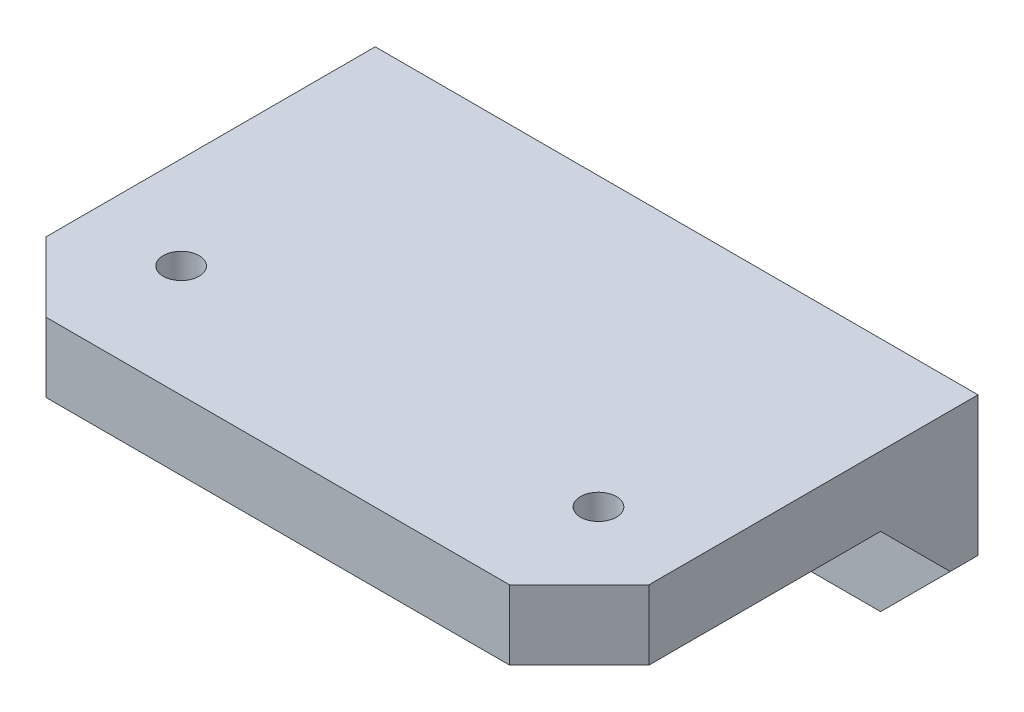
ISO-10303-21;
HEADER;
FILE_DESCRIPTION(('STEP AP214'),'2;1');
FILE_NAME('part.step','',(''),(''),'','','');
FILE_SCHEMA(('AUTOMOTIVE_DESIGN { 1 0 10303 214 1 1 1 1 }'));
ENDSEC;
DATA;
#1=APPLICATION_CONTEXT('core data for automotive mechanical design processes');
#2=APPLICATION_PROTOCOL_DEFINITION('international standard','automotive_design',2000,#1);
#3=PRODUCT_CONTEXT('',#1,'mechanical');
#4=PRODUCT('Part','Part','',(#3));
#5=PRODUCT_RELATED_PRODUCT_CATEGORY('part','',(#4));
#6=PRODUCT_DEFINITION_FORMATION('','',#4);
#7=PRODUCT_DEFINITION_CONTEXT('part definition',#1,'design');
#8=PRODUCT_DEFINITION('design','',#6,#7);
#9=PRODUCT_DEFINITION_SHAPE('','',#8);
#10=(LENGTH_UNIT() NAMED_UNIT(*) SI_UNIT(.MILLI.,.METRE.));
#11=(NAMED_UNIT(*) PLANE_ANGLE_UNIT() SI_UNIT($,.RADIAN.));
#12=(NAMED_UNIT(*) SI_UNIT($,.STERADIAN.) SOLID_ANGLE_UNIT());
#13=UNCERTAINTY_MEASURE_WITH_UNIT(LENGTH_MEASURE(1.E-05),#10,'distance_accuracy_value','');
#14=(GEOMETRIC_REPRESENTATION_CONTEXT(3) GLOBAL_UNCERTAINTY_ASSIGNED_CONTEXT((#13)) GLOBAL_UNIT_ASSIGNED_CONTEXT((#10,
#11,#12)) REPRESENTATION_CONTEXT('',''));
#15=CARTESIAN_POINT('',(0.,0.,0.));
#16=DIRECTION('',(0.,0.,1.));
#17=DIRECTION('',(1.,0.,0.));
#18=AXIS2_PLACEMENT_3D('',#15,#16,#17);
#19=CARTESIAN_POINT('',(-209.038766336441,-34.925,15.8750000000001));
#20=DIRECTION('',(0.,-0.707106781186551,0.707106781186544));
#21=DIRECTION('',(-1.,0.,0.));
#22=AXIS2_PLACEMENT_3D('',#19,#20,#21);
#23=PLANE('',#22);
#24=CARTESIAN_POINT('',(-193.163766336441,-44.45,6.35));
#25=DIRECTION('',(0.,-0.707106781186551,0.707106781186544));
#26=DIRECTION('',(0.,-0.707106781186544,-0.707106781186551));
#27=AXIS2_PLACEMENT_3D('',#24,#25,#26);
#28=ELLIPSE('',#27,8.98025612106919,6.35);
#29=CARTESIAN_POINT('',(-199.513766336441,-44.45,6.35));
#30=VERTEX_POINT('',#29);
#31=CARTESIAN_POINT('',(-186.813766336441,-44.45,6.35));
#32=VERTEX_POINT('',#31);
#33=EDGE_CURVE('E143',#30,#32,#28,.F.);
#34=ORIENTED_EDGE('',*,*,#33,.T.);
#35=DIRECTION('',(-1.,0.,0.));
#36=VECTOR('',#35,1.);
#37=CARTESIAN_POINT('',(-209.038766336441,-44.45,6.35));
#38=LINE('',#37,#36);
#39=CARTESIAN_POINT('',(-148.713766336441,-44.45,6.35));
#40=VERTEX_POINT('',#39);
#41=EDGE_CURVE('E160',#40,#32,#38,.T.);
#42=ORIENTED_EDGE('',*,*,#41,.F.);
#43=CARTESIAN_POINT('',(-142.363766336441,-44.45,6.35));
#44=DIRECTION('',(0.,-0.707106781186551,0.707106781186544));
#45=DIRECTION('',(0.,-0.707106781186544,-0.707106781186551));
#46=AXIS2_PLACEMENT_3D('',#43,#44,#45);
#47=ELLIPSE('',#46,8.98025612106919,6.35);
#48=CARTESIAN_POINT('',(-136.013766336441,-44.45,6.35));
#49=VERTEX_POINT('',#48);
#50=EDGE_CURVE('E261',#40,#49,#47,.F.);
#51=ORIENTED_EDGE('',*,*,#50,.T.);
#52=CARTESIAN_POINT('',(-126.488766336441,-44.45,6.35));
#53=VERTEX_POINT('',#52);
#54=EDGE_CURVE('E168',#53,#49,#38,.T.);
#55=ORIENTED_EDGE('',*,*,#54,.F.);
#56=DIRECTION('',(0.,0.707106781186544,0.707106781186551));
#57=VECTOR('',#56,1.);
#58=CARTESIAN_POINT('',(-126.488766336441,-34.9250000000001,15.875));
#59=LINE('',#58,#57);
#60=CARTESIAN_POINT('',(-126.488766336441,-34.925,15.8750000000001));
#61=VERTEX_POINT('',#60);
#62=EDGE_CURVE('E202',#61,#53,#59,.F.);
#63=ORIENTED_EDGE('',*,*,#62,.F.);
#64=DIRECTION('',(1.,0.,0.));
#65=VECTOR('',#64,1.);
#66=CARTESIAN_POINT('',(-126.488766336441,-34.925,15.8750000000001));
#67=LINE('',#66,#65);
#68=CARTESIAN_POINT('',(-209.038766336441,-34.925,15.8750000000001));
#69=VERTEX_POINT('',#68);
#70=EDGE_CURVE('E191',#69,#61,#67,.T.);
#71=ORIENTED_EDGE('',*,*,#70,.F.);
#72=DIRECTION('',(0.,-0.707106781186544,-0.707106781186551));
#73=VECTOR('',#72,1.);
#74=CARTESIAN_POINT('',(-209.038766336441,-34.9250000000001,15.875));
#75=LINE('',#74,#73);
#76=CARTESIAN_POINT('',(-209.038766336441,-44.45,6.35));
#77=VERTEX_POINT('',#76);
#78=EDGE_CURVE('E165',#77,#69,#75,.F.);
#79=ORIENTED_EDGE('',*,*,#78,.F.);
#80=EDGE_CURVE('E157',#30,#77,#38,.T.);
#81=ORIENTED_EDGE('',*,*,#80,.F.);
#82=EDGE_LOOP('',(#34,#42,#51,#55,#63,#71,#79,#81));
#83=FACE_BOUND('',#82,.T.);
#84=ADVANCED_FACE('F35',(#83),#23,.T.);
#85=CARTESIAN_POINT('',(-142.363766336441,-44.45,57.15));
#86=DIRECTION('',(0.,0.,1.));
#87=DIRECTION('',(1.,0.,0.));
#88=AXIS2_PLACEMENT_3D('',#85,#86,#87);
#89=CYLINDRICAL_SURFACE('',#88,2.45745);
#90=CARTESIAN_POINT('',(-142.363766336441,-44.45,0.));
#91=DIRECTION('',(0.,0.,1.));
#92=DIRECTION('',(1.,0.,0.));
#93=AXIS2_PLACEMENT_3D('',#90,#91,#92);
#94=CIRCLE('',#93,2.45745);
#95=CARTESIAN_POINT('',(-139.906316336441,-44.45,0.));
#96=VERTEX_POINT('',#95);
#97=EDGE_CURVE('E271',#96,#96,#94,.T.);
#98=ORIENTED_EDGE('',*,*,#97,.F.);
#99=EDGE_LOOP('',(#98));
#100=FACE_BOUND('',#99,.T.);
#101=CARTESIAN_POINT('',(-142.363766336441,-44.45,6.35));
#102=DIRECTION('',(0.,0.,-1.));
#103=DIRECTION('',(-1.,0.,0.));
#104=AXIS2_PLACEMENT_3D('',#101,#102,#103);
#105=CIRCLE('',#104,2.45745);
#106=CARTESIAN_POINT('',(-144.821216336441,-44.45,6.35));
#107=VERTEX_POINT('',#106);
#108=EDGE_CURVE('E274',#107,#107,#105,.T.);
#109=ORIENTED_EDGE('',*,*,#108,.F.);
#110=EDGE_LOOP('',(#109));
#111=FACE_BOUND('',#110,.T.);
#112=ADVANCED_FACE('F362',(#100,#111),#89,.F.);
#113=CARTESIAN_POINT('',(-193.163766336441,-44.45,57.15));
#114=DIRECTION('',(0.,0.,1.));
#115=DIRECTION('',(1.,0.,0.));
#116=AXIS2_PLACEMENT_3D('',#113,#114,#115);
#117=CYLINDRICAL_SURFACE('',#116,2.45745);
#118=CARTESIAN_POINT('',(-193.163766336441,-44.45,0.));
#119=DIRECTION('',(0.,0.,1.));
#120=DIRECTION('',(1.,0.,0.));
#121=AXIS2_PLACEMENT_3D('',#118,#119,#120);
#122=CIRCLE('',#121,2.45745);
#123=CARTESIAN_POINT('',(-190.706316336441,-44.45,0.));
#124=VERTEX_POINT('',#123);
#125=EDGE_CURVE('E161',#124,#124,#122,.T.);
#126=ORIENTED_EDGE('',*,*,#125,.F.);
#127=EDGE_LOOP('',(#126));
#128=FACE_BOUND('',#127,.T.);
#129=CARTESIAN_POINT('',(-193.163766336441,-44.45,6.35));
#130=DIRECTION('',(0.,0.,-1.));
#131=DIRECTION('',(-1.,0.,0.));
#132=AXIS2_PLACEMENT_3D('',#129,#130,#131);
#133=CIRCLE('',#132,2.45745);
#134=CARTESIAN_POINT('',(-195.621216336441,-44.45,6.35));
#135=VERTEX_POINT('',#134);
#136=EDGE_CURVE('E268',#135,#135,#133,.T.);
#137=ORIENTED_EDGE('',*,*,#136,.F.);
#138=EDGE_LOOP('',(#137));
#139=FACE_BOUND('',#138,.T.);
#140=ADVANCED_FACE('F365',(#128,#139),#117,.F.);
#141=CARTESIAN_POINT('',(0.,0.,6.35));
#142=DIRECTION('',(0.,0.,-1.));
#143=DIRECTION('',(-1.,0.,0.));
#144=AXIS2_PLACEMENT_3D('',#141,#142,#143);
#145=PLANE('',#144);
#146=CARTESIAN_POINT('',(-193.163766336441,-44.45,6.35));
#147=DIRECTION('',(0.,0.,1.));
#148=DIRECTION('',(1.,0.,0.));
#149=AXIS2_PLACEMENT_3D('',#146,#147,#148);
#150=CIRCLE('',#149,6.35);
#151=EDGE_CURVE('E146',#32,#30,#150,.T.);
#152=ORIENTED_EDGE('',*,*,#151,.T.);
#153=ORIENTED_EDGE('',*,*,#80,.T.);
#154=DIRECTION('',(-0.707106781186546,0.707106781186549,0.));
#155=VECTOR('',#154,1.);
#156=CARTESIAN_POINT('',(-199.513766336441,-53.975,6.35));
#157=LINE('',#156,#155);
#158=CARTESIAN_POINT('',(-199.513766336441,-53.975,6.35));
#159=VERTEX_POINT('',#158);
#160=EDGE_CURVE('E173',#77,#159,#157,.F.);
#161=ORIENTED_EDGE('',*,*,#160,.T.);
#162=DIRECTION('',(1.,0.,0.));
#163=VECTOR('',#162,1.);
#164=CARTESIAN_POINT('',(-209.038766336441,-53.975,6.35));
#165=LINE('',#164,#163);
#166=CARTESIAN_POINT('',(-136.013766336441,-53.975,6.35));
#167=VERTEX_POINT('',#166);
#168=EDGE_CURVE('E289',#159,#167,#165,.T.);
#169=ORIENTED_EDGE('',*,*,#168,.T.);
#170=DIRECTION('',(-0.707106781186549,-0.707106781186546,0.));
#171=VECTOR('',#170,1.);
#172=CARTESIAN_POINT('',(-126.488766336441,-44.45,6.35));
#173=LINE('',#172,#171);
#174=EDGE_CURVE('E176',#167,#53,#173,.F.);
#175=ORIENTED_EDGE('',*,*,#174,.T.);
#176=ORIENTED_EDGE('',*,*,#54,.T.);
#177=CARTESIAN_POINT('',(-142.363766336441,-44.45,6.35));
#178=DIRECTION('',(0.,0.,1.));
#179=DIRECTION('',(1.,0.,0.));
#180=AXIS2_PLACEMENT_3D('',#177,#178,#179);
#181=CIRCLE('',#180,6.35);
#182=EDGE_CURVE('E151',#49,#40,#181,.T.);
#183=ORIENTED_EDGE('',*,*,#182,.T.);
#184=ORIENTED_EDGE('',*,*,#41,.T.);
#185=EDGE_LOOP('',(#152,#153,#161,#169,#175,#176,#183,#184));
#186=FACE_BOUND('',#185,.T.);
#187=ORIENTED_EDGE('',*,*,#136,.T.);
#188=EDGE_LOOP('',(#187));
#189=FACE_BOUND('',#188,.T.);
#190=ORIENTED_EDGE('',*,*,#108,.T.);
#191=EDGE_LOOP('',(#190));
#192=FACE_BOUND('',#191,.T.);
#193=ADVANCED_FACE('F155',(#186,#189,#192),#145,.F.);
#194=CARTESIAN_POINT('',(-151.095016336441,-53.975,6.35));
#195=DIRECTION('',(0.,1.,0.));
#196=DIRECTION('',(0.,0.,1.));
#197=AXIS2_PLACEMENT_3D('',#194,#195,#196);
#198=PLANE('',#197);
#199=DIRECTION('',(0.,0.,-1.));
#200=VECTOR('',#199,1.);
#201=CARTESIAN_POINT('',(-199.513766336441,-53.975,6.35));
#202=LINE('',#201,#200);
#203=CARTESIAN_POINT('',(-199.513766336441,-53.975,2.54000000000001));
#204=VERTEX_POINT('',#203);
#205=EDGE_CURVE('E169',#159,#204,#202,.T.);
#206=ORIENTED_EDGE('',*,*,#205,.T.);
#207=DIRECTION('',(1.,0.,0.));
#208=VECTOR('',#207,1.);
#209=CARTESIAN_POINT('',(-136.013766336441,-53.975,2.54000000000001));
#210=LINE('',#209,#208);
#211=CARTESIAN_POINT('',(-136.013766336441,-53.975,2.54000000000001));
#212=VERTEX_POINT('',#211);
#213=EDGE_CURVE('E225',#204,#212,#210,.T.);
#214=ORIENTED_EDGE('',*,*,#213,.T.);
#215=DIRECTION('',(0.,0.,1.));
#216=VECTOR('',#215,1.);
#217=CARTESIAN_POINT('',(-136.013766336441,-53.975,6.35));
#218=LINE('',#217,#216);
#219=EDGE_CURVE('E166',#212,#167,#218,.T.);
#220=ORIENTED_EDGE('',*,*,#219,.T.);
#221=ORIENTED_EDGE('',*,*,#168,.F.);
#222=EDGE_LOOP('',(#206,#214,#220,#221));
#223=FACE_BOUND('',#222,.T.);
#224=ADVANCED_FACE('F303',(#223),#198,.F.);
#225=CARTESIAN_POINT('',(-126.488766336441,-25.4,6.35));
#226=DIRECTION('',(-1.,0.,0.));
#227=DIRECTION('',(0.,0.,1.));
#228=AXIS2_PLACEMENT_3D('',#225,#226,#227);
#229=PLANE('',#228);
#230=DIRECTION('',(0.,0.,-1.));
#231=VECTOR('',#230,1.);
#232=CARTESIAN_POINT('',(-126.488766336441,-44.45,6.35));
#233=LINE('',#232,#231);
#234=CARTESIAN_POINT('',(-126.488766336441,-44.45,2.54000000000002));
#235=VERTEX_POINT('',#234);
#236=EDGE_CURVE('E298',#53,#235,#233,.T.);
#237=ORIENTED_EDGE('',*,*,#236,.T.);
#238=DIRECTION('',(0.,1.,0.));
#239=VECTOR('',#238,1.);
#240=CARTESIAN_POINT('',(-126.488766336441,-25.4,2.54000000000001));
#241=LINE('',#240,#239);
#242=CARTESIAN_POINT('',(-126.488766336441,-25.4,2.54000000000001));
#243=VERTEX_POINT('',#242);
#244=EDGE_CURVE('E221',#235,#243,#241,.T.);
#245=ORIENTED_EDGE('',*,*,#244,.T.);
#246=DIRECTION('',(0.,0.,-1.));
#247=VECTOR('',#246,1.);
#248=CARTESIAN_POINT('',(-126.488766336441,-25.4,6.35));
#249=LINE('',#248,#247);
#250=CARTESIAN_POINT('',(-126.488766336441,-25.4,47.625));
#251=VERTEX_POINT('',#250);
#252=EDGE_CURVE('E293',#251,#243,#249,.T.);
#253=ORIENTED_EDGE('',*,*,#252,.F.);
#254=DIRECTION('',(0.,-1.,0.));
#255=VECTOR('',#254,1.);
#256=CARTESIAN_POINT('',(-126.488766336441,-34.925,47.625));
#257=LINE('',#256,#255);
#258=CARTESIAN_POINT('',(-126.488766336441,-34.925,47.625));
#259=VERTEX_POINT('',#258);
#260=EDGE_CURVE('E296',#251,#259,#257,.T.);
#261=ORIENTED_EDGE('',*,*,#260,.T.);
#262=DIRECTION('',(0.,0.,-1.));
#263=VECTOR('',#262,1.);
#264=CARTESIAN_POINT('',(-126.488766336441,-34.925,57.15));
#265=LINE('',#264,#263);
#266=EDGE_CURVE('E283',#259,#61,#265,.T.);
#267=ORIENTED_EDGE('',*,*,#266,.T.);
#268=ORIENTED_EDGE('',*,*,#62,.T.);
#269=EDGE_LOOP('',(#237,#245,#253,#261,#267,#268));
#270=FACE_BOUND('',#269,.T.);
#271=ADVANCED_FACE('F315',(#270),#229,.F.);
#272=CARTESIAN_POINT('',(-209.038766336441,-25.4,6.35));
#273=DIRECTION('',(0.,-1.,0.));
#274=DIRECTION('',(0.,0.,-1.));
#275=AXIS2_PLACEMENT_3D('',#272,#273,#274);
#276=PLANE('',#275);
#277=CARTESIAN_POINT('',(-196.338766336441,-25.4,41.818328596662));
#278=DIRECTION('',(0.,-1.,0.));
#279=DIRECTION('',(0.,0.,-1.));
#280=AXIS2_PLACEMENT_3D('',#277,#278,#279);
#281=CIRCLE('',#280,2.45745);
#282=CARTESIAN_POINT('',(-196.338766336441,-25.4,39.360878596662));
#283=VERTEX_POINT('',#282);
#284=EDGE_CURVE('E249',#283,#283,#281,.T.);
#285=ORIENTED_EDGE('',*,*,#284,.T.);
#286=EDGE_LOOP('',(#285));
#287=FACE_BOUND('',#286,.T.);
#288=CARTESIAN_POINT('',(-139.188766336441,-25.4,41.818328596662));
#289=DIRECTION('',(0.,-1.,0.));
#290=DIRECTION('',(0.,0.,-1.));
#291=AXIS2_PLACEMENT_3D('',#288,#289,#290);
#292=CIRCLE('',#291,2.45745);
#293=CARTESIAN_POINT('',(-139.188766336441,-25.4,39.360878596662));
#294=VERTEX_POINT('',#293);
#295=EDGE_CURVE('E259',#294,#294,#292,.T.);
#296=ORIENTED_EDGE('',*,*,#295,.T.);
#297=EDGE_LOOP('',(#296));
#298=FACE_BOUND('',#297,.T.);
#299=ORIENTED_EDGE('',*,*,#252,.T.);
#300=DIRECTION('',(-1.,0.,0.));
#301=VECTOR('',#300,1.);
#302=CARTESIAN_POINT('',(-209.038766336441,-25.4,2.54000000000001));
#303=LINE('',#302,#301);
#304=CARTESIAN_POINT('',(-209.038766336441,-25.4,2.54000000000001));
#305=VERTEX_POINT('',#304);
#306=EDGE_CURVE('E205',#243,#305,#303,.T.);
#307=ORIENTED_EDGE('',*,*,#306,.T.);
#308=DIRECTION('',(0.,0.,-1.));
#309=VECTOR('',#308,1.);
#310=CARTESIAN_POINT('',(-209.038766336441,-25.4,6.35));
#311=LINE('',#310,#309);
#312=CARTESIAN_POINT('',(-209.038766336441,-25.4,47.625));
#313=VERTEX_POINT('',#312);
#314=EDGE_CURVE('E291',#313,#305,#311,.T.);
#315=ORIENTED_EDGE('',*,*,#314,.F.);
#316=DIRECTION('',(0.707106781186546,0.,0.707106781186549));
#317=VECTOR('',#316,1.);
#318=CARTESIAN_POINT('',(-199.513766336441,-25.4,57.15));
#319=LINE('',#318,#317);
#320=CARTESIAN_POINT('',(-199.513766336441,-25.4,57.15));
#321=VERTEX_POINT('',#320);
#322=EDGE_CURVE('E187',#313,#321,#319,.T.);
#323=ORIENTED_EDGE('',*,*,#322,.T.);
#324=DIRECTION('',(-1.,0.,0.));
#325=VECTOR('',#324,1.);
#326=CARTESIAN_POINT('',(-209.038766336441,-25.4,57.15));
#327=LINE('',#326,#325);
#328=CARTESIAN_POINT('',(-136.013766336441,-25.4,57.15));
#329=VERTEX_POINT('',#328);
#330=EDGE_CURVE('E280',#329,#321,#327,.T.);
#331=ORIENTED_EDGE('',*,*,#330,.F.);
#332=DIRECTION('',(0.707106781186547,0.,-0.707106781186549));
#333=VECTOR('',#332,1.);
#334=CARTESIAN_POINT('',(-136.013766336441,-25.4,57.15));
#335=LINE('',#334,#333);
#336=EDGE_CURVE('E189',#329,#251,#335,.T.);
#337=ORIENTED_EDGE('',*,*,#336,.T.);
#338=EDGE_LOOP('',(#299,#307,#315,#323,#331,#337));
#339=FACE_BOUND('',#338,.T.);
#340=ADVANCED_FACE('F332',(#287,#298,#339),#276,.F.);
#341=CARTESIAN_POINT('',(-209.038766336441,-25.4,6.35));
#342=DIRECTION('',(1.,0.,0.));
#343=DIRECTION('',(0.,0.,-1.));
#344=AXIS2_PLACEMENT_3D('',#341,#342,#343);
#345=PLANE('',#344);
#346=ORIENTED_EDGE('',*,*,#314,.T.);
#347=DIRECTION('',(0.,-1.,0.));
#348=VECTOR('',#347,1.);
#349=CARTESIAN_POINT('',(-209.038766336441,-44.4499999999999,2.54000000000001));
#350=LINE('',#349,#348);
#351=CARTESIAN_POINT('',(-209.038766336441,-44.4499999999999,2.54000000000001));
#352=VERTEX_POINT('',#351);
#353=EDGE_CURVE('E11',#305,#352,#350,.T.);
#354=ORIENTED_EDGE('',*,*,#353,.T.);
#355=DIRECTION('',(0.,0.,1.));
#356=VECTOR('',#355,1.);
#357=CARTESIAN_POINT('',(-209.038766336441,-44.4499999999999,6.35));
#358=LINE('',#357,#356);
#359=EDGE_CURVE('E198',#352,#77,#358,.T.);
#360=ORIENTED_EDGE('',*,*,#359,.T.);
#361=ORIENTED_EDGE('',*,*,#78,.T.);
#362=DIRECTION('',(0.,0.,-1.));
#363=VECTOR('',#362,1.);
#364=CARTESIAN_POINT('',(-209.038766336441,-34.925,57.15));
#365=LINE('',#364,#363);
#366=CARTESIAN_POINT('',(-209.038766336441,-34.925,47.625));
#367=VERTEX_POINT('',#366);
#368=EDGE_CURVE('E286',#367,#69,#365,.T.);
#369=ORIENTED_EDGE('',*,*,#368,.F.);
#370=DIRECTION('',(0.,1.,0.));
#371=VECTOR('',#370,1.);
#372=CARTESIAN_POINT('',(-209.038766336441,-25.4,47.625));
#373=LINE('',#372,#371);
#374=EDGE_CURVE('E200',#367,#313,#373,.T.);
#375=ORIENTED_EDGE('',*,*,#374,.T.);
#376=EDGE_LOOP('',(#346,#354,#360,#361,#369,#375));
#377=FACE_BOUND('',#376,.T.);
#378=ADVANCED_FACE('F324',(#377),#345,.F.);
#379=CARTESIAN_POINT('',(0.,0.,0.));
#380=DIRECTION('',(0.,0.,-1.));
#381=DIRECTION('',(-1.,0.,0.));
#382=AXIS2_PLACEMENT_3D('',#379,#380,#381);
#383=PLANE('',#382);
#384=DIRECTION('',(0.,1.,0.));
#385=VECTOR('',#384,1.);
#386=CARTESIAN_POINT('',(-206.498766336441,-25.4,0.));
#387=LINE('',#386,#385);
#388=CARTESIAN_POINT('',(-206.498766336441,-43.3978975515723,0.));
#389=VERTEX_POINT('',#388);
#390=CARTESIAN_POINT('',(-206.498766336441,-27.94,0.));
#391=VERTEX_POINT('',#390);
#392=EDGE_CURVE('E208',#389,#391,#387,.T.);
#393=ORIENTED_EDGE('',*,*,#392,.T.);
#394=DIRECTION('',(1.,0.,0.));
#395=VECTOR('',#394,1.);
#396=CARTESIAN_POINT('',(-126.488766336441,-27.94,0.));
#397=LINE('',#396,#395);
#398=CARTESIAN_POINT('',(-129.028766336441,-27.94,0.));
#399=VERTEX_POINT('',#398);
#400=EDGE_CURVE('E218',#391,#399,#397,.T.);
#401=ORIENTED_EDGE('',*,*,#400,.T.);
#402=DIRECTION('',(0.,-1.,0.));
#403=VECTOR('',#402,1.);
#404=CARTESIAN_POINT('',(-129.028766336441,-44.45,0.));
#405=LINE('',#404,#403);
#406=CARTESIAN_POINT('',(-129.028766336441,-43.3978975515723,0.));
#407=VERTEX_POINT('',#406);
#408=EDGE_CURVE('E216',#399,#407,#405,.T.);
#409=ORIENTED_EDGE('',*,*,#408,.T.);
#410=DIRECTION('',(-0.707106781186549,-0.707106781186546,0.));
#411=VECTOR('',#410,1.);
#412=CARTESIAN_POINT('',(-42.8154343924341,42.8154343924343,0.));
#413=LINE('',#412,#411);
#414=CARTESIAN_POINT('',(-137.065868784869,-51.435,0.));
#415=VERTEX_POINT('',#414);
#416=EDGE_CURVE('E214',#407,#415,#413,.T.);
#417=ORIENTED_EDGE('',*,*,#416,.T.);
#418=DIRECTION('',(-1.,0.,0.));
#419=VECTOR('',#418,1.);
#420=CARTESIAN_POINT('',(-199.513766336441,-51.435,0.));
#421=LINE('',#420,#419);
#422=CARTESIAN_POINT('',(-198.461663888013,-51.435,0.));
#423=VERTEX_POINT('',#422);
#424=EDGE_CURVE('E212',#415,#423,#421,.T.);
#425=ORIENTED_EDGE('',*,*,#424,.T.);
#426=DIRECTION('',(-0.707106781186546,0.707106781186549,0.));
#427=VECTOR('',#426,1.);
#428=CARTESIAN_POINT('',(-124.948331944007,-124.948331944006,0.));
#429=LINE('',#428,#427);
#430=EDGE_CURVE('E210',#423,#389,#429,.T.);
#431=ORIENTED_EDGE('',*,*,#430,.T.);
#432=EDGE_LOOP('',(#393,#401,#409,#417,#425,#431));
#433=FACE_BOUND('',#432,.T.);
#434=ORIENTED_EDGE('',*,*,#125,.T.);
#435=EDGE_LOOP('',(#434));
#436=FACE_BOUND('',#435,.T.);
#437=ORIENTED_EDGE('',*,*,#97,.T.);
#438=EDGE_LOOP('',(#437));
#439=FACE_BOUND('',#438,.T.);
#440=ADVANCED_FACE('F354',(#433,#436,#439),#383,.T.);
#441=CARTESIAN_POINT('',(-209.038766336441,-34.925,57.15));
#442=DIRECTION('',(0.,1.,0.));
#443=DIRECTION('',(0.,0.,1.));
#444=AXIS2_PLACEMENT_3D('',#441,#442,#443);
#445=PLANE('',#444);
#446=CARTESIAN_POINT('',(-196.338766336441,-34.925,41.818328596662));
#447=DIRECTION('',(0.,-1.,0.));
#448=DIRECTION('',(0.,0.,-1.));
#449=AXIS2_PLACEMENT_3D('',#446,#447,#448);
#450=CIRCLE('',#449,2.45745);
#451=CARTESIAN_POINT('',(-196.338766336441,-34.925,39.360878596662));
#452=VERTEX_POINT('',#451);
#453=EDGE_CURVE('E243',#452,#452,#450,.T.);
#454=ORIENTED_EDGE('',*,*,#453,.F.);
#455=EDGE_LOOP('',(#454));
#456=FACE_BOUND('',#455,.T.);
#457=CARTESIAN_POINT('',(-139.188766336441,-34.925,41.818328596662));
#458=DIRECTION('',(0.,-1.,0.));
#459=DIRECTION('',(0.,0.,-1.));
#460=AXIS2_PLACEMENT_3D('',#457,#458,#459);
#461=CIRCLE('',#460,2.45745);
#462=CARTESIAN_POINT('',(-139.188766336441,-34.925,39.360878596662));
#463=VERTEX_POINT('',#462);
#464=EDGE_CURVE('E254',#463,#463,#461,.T.);
#465=ORIENTED_EDGE('',*,*,#464,.F.);
#466=EDGE_LOOP('',(#465));
#467=FACE_BOUND('',#466,.T.);
#468=ORIENTED_EDGE('',*,*,#266,.F.);
#469=DIRECTION('',(-0.707106781186547,0.,0.707106781186549));
#470=VECTOR('',#469,1.);
#471=CARTESIAN_POINT('',(-136.013766336441,-34.925,57.15));
#472=LINE('',#471,#470);
#473=CARTESIAN_POINT('',(-136.013766336441,-34.925,57.15));
#474=VERTEX_POINT('',#473);
#475=EDGE_CURVE('E196',#259,#474,#472,.T.);
#476=ORIENTED_EDGE('',*,*,#475,.T.);
#477=DIRECTION('',(1.,0.,0.));
#478=VECTOR('',#477,1.);
#479=CARTESIAN_POINT('',(-209.038766336441,-34.925,57.15));
#480=LINE('',#479,#478);
#481=CARTESIAN_POINT('',(-199.513766336441,-34.925,57.15));
#482=VERTEX_POINT('',#481);
#483=EDGE_CURVE('E277',#482,#474,#480,.T.);
#484=ORIENTED_EDGE('',*,*,#483,.F.);
#485=DIRECTION('',(-0.707106781186546,0.,-0.707106781186549));
#486=VECTOR('',#485,1.);
#487=CARTESIAN_POINT('',(-199.513766336441,-34.925,57.15));
#488=LINE('',#487,#486);
#489=EDGE_CURVE('E194',#482,#367,#488,.T.);
#490=ORIENTED_EDGE('',*,*,#489,.T.);
#491=ORIENTED_EDGE('',*,*,#368,.T.);
#492=ORIENTED_EDGE('',*,*,#70,.T.);
#493=EDGE_LOOP('',(#468,#476,#484,#490,#491,#492));
#494=FACE_BOUND('',#493,.T.);
#495=ADVANCED_FACE('F319',(#456,#467,#494),#445,.F.);
#496=CARTESIAN_POINT('',(0.,0.,57.15));
#497=DIRECTION('',(0.,0.,1.));
#498=DIRECTION('',(1.,0.,0.));
#499=AXIS2_PLACEMENT_3D('',#496,#497,#498);
#500=PLANE('',#499);
#501=ORIENTED_EDGE('',*,*,#483,.T.);
#502=DIRECTION('',(0.,1.,0.));
#503=VECTOR('',#502,1.);
#504=CARTESIAN_POINT('',(-136.013766336441,-25.4,57.15));
#505=LINE('',#504,#503);
#506=EDGE_CURVE('E184',#474,#329,#505,.T.);
#507=ORIENTED_EDGE('',*,*,#506,.T.);
#508=ORIENTED_EDGE('',*,*,#330,.T.);
#509=DIRECTION('',(0.,-1.,0.));
#510=VECTOR('',#509,1.);
#511=CARTESIAN_POINT('',(-199.513766336441,-34.925,57.15));
#512=LINE('',#511,#510);
#513=EDGE_CURVE('E179',#321,#482,#512,.T.);
#514=ORIENTED_EDGE('',*,*,#513,.T.);
#515=EDGE_LOOP('',(#501,#507,#508,#514));
#516=FACE_BOUND('',#515,.T.);
#517=ADVANCED_FACE('F334',(#516),#500,.T.);
#518=CARTESIAN_POINT('',(-126.488766336441,-44.45,6.35));
#519=DIRECTION('',(-0.707106781186546,0.707106781186549,0.));
#520=DIRECTION('',(0.,0.,-1.));
#521=AXIS2_PLACEMENT_3D('',#518,#519,#520);
#522=PLANE('',#521);
#523=ORIENTED_EDGE('',*,*,#219,.F.);
#524=DIRECTION('',(-0.707106781186549,-0.707106781186546,0.));
#525=VECTOR('',#524,1.);
#526=CARTESIAN_POINT('',(-126.488766336441,-44.45,2.54000000000002));
#527=LINE('',#526,#525);
#528=EDGE_CURVE('E223',#212,#235,#527,.F.);
#529=ORIENTED_EDGE('',*,*,#528,.T.);
#530=ORIENTED_EDGE('',*,*,#236,.F.);
#531=ORIENTED_EDGE('',*,*,#174,.F.);
#532=EDGE_LOOP('',(#523,#529,#530,#531));
#533=FACE_BOUND('',#532,.T.);
#534=ADVANCED_FACE('F312',(#533),#522,.F.);
#535=CARTESIAN_POINT('',(-136.013766336441,0.,57.15));
#536=DIRECTION('',(0.707106781186549,0.,0.707106781186547));
#537=DIRECTION('',(0.,-1.,0.));
#538=AXIS2_PLACEMENT_3D('',#535,#536,#537);
#539=PLANE('',#538);
#540=ORIENTED_EDGE('',*,*,#475,.F.);
#541=ORIENTED_EDGE('',*,*,#260,.F.);
#542=ORIENTED_EDGE('',*,*,#336,.F.);
#543=ORIENTED_EDGE('',*,*,#506,.F.);
#544=EDGE_LOOP('',(#540,#541,#542,#543));
#545=FACE_BOUND('',#544,.T.);
#546=ADVANCED_FACE('F337',(#545),#539,.T.);
#547=CARTESIAN_POINT('',(-199.513766336441,0.,57.15));
#548=DIRECTION('',(-0.707106781186549,0.,0.707106781186546));
#549=DIRECTION('',(0.,1.,0.));
#550=AXIS2_PLACEMENT_3D('',#547,#548,#549);
#551=PLANE('',#550);
#552=ORIENTED_EDGE('',*,*,#322,.F.);
#553=ORIENTED_EDGE('',*,*,#374,.F.);
#554=ORIENTED_EDGE('',*,*,#489,.F.);
#555=ORIENTED_EDGE('',*,*,#513,.F.);
#556=EDGE_LOOP('',(#552,#553,#554,#555));
#557=FACE_BOUND('',#556,.T.);
#558=ADVANCED_FACE('F328',(#557),#551,.T.);
#559=CARTESIAN_POINT('',(-199.513766336441,-53.975,6.35));
#560=DIRECTION('',(0.707106781186549,0.707106781186546,0.));
#561=DIRECTION('',(0.,0.,-1.));
#562=AXIS2_PLACEMENT_3D('',#559,#560,#561);
#563=PLANE('',#562);
#564=ORIENTED_EDGE('',*,*,#359,.F.);
#565=DIRECTION('',(-0.707106781186546,0.707106781186549,0.));
#566=VECTOR('',#565,1.);
#567=CARTESIAN_POINT('',(-199.513766336441,-53.975,2.54000000000001));
#568=LINE('',#567,#566);
#569=EDGE_CURVE('E45',#352,#204,#568,.F.);
#570=ORIENTED_EDGE('',*,*,#569,.T.);
#571=ORIENTED_EDGE('',*,*,#205,.F.);
#572=ORIENTED_EDGE('',*,*,#160,.F.);
#573=EDGE_LOOP('',(#564,#570,#571,#572));
#574=FACE_BOUND('',#573,.T.);
#575=ADVANCED_FACE('F389',(#574),#563,.F.);
#576=CARTESIAN_POINT('',(-193.163766336441,-44.45,57.151));
#577=DIRECTION('',(0.,0.,-1.));
#578=DIRECTION('',(-1.,0.,0.));
#579=AXIS2_PLACEMENT_3D('',#576,#577,#578);
#580=CYLINDRICAL_SURFACE('',#579,6.35);
#581=ORIENTED_EDGE('',*,*,#151,.F.);
#582=ORIENTED_EDGE('',*,*,#33,.F.);
#583=EDGE_LOOP('',(#581,#582));
#584=FACE_BOUND('',#583,.T.);
#585=ADVANCED_FACE('F145',(#584),#580,.F.);
#586=CARTESIAN_POINT('',(-142.363766336441,-44.45,57.151));
#587=DIRECTION('',(0.,0.,-1.));
#588=DIRECTION('',(-1.,0.,0.));
#589=AXIS2_PLACEMENT_3D('',#586,#587,#588);
#590=CYLINDRICAL_SURFACE('',#589,6.35);
#591=ORIENTED_EDGE('',*,*,#182,.F.);
#592=ORIENTED_EDGE('',*,*,#50,.F.);
#593=EDGE_LOOP('',(#591,#592));
#594=FACE_BOUND('',#593,.T.);
#595=ADVANCED_FACE('F427',(#594),#590,.F.);
#596=CARTESIAN_POINT('',(-139.188766336441,-34.925,41.818328596662));
#597=DIRECTION('',(0.,-1.,0.));
#598=DIRECTION('',(0.,0.,-1.));
#599=AXIS2_PLACEMENT_3D('',#596,#597,#598);
#600=CYLINDRICAL_SURFACE('',#599,2.45745);
#601=ORIENTED_EDGE('',*,*,#295,.F.);
#602=EDGE_LOOP('',(#601));
#603=FACE_BOUND('',#602,.T.);
#604=ORIENTED_EDGE('',*,*,#464,.T.);
#605=EDGE_LOOP('',(#604));
#606=FACE_BOUND('',#605,.T.);
#607=ADVANCED_FACE('F421',(#603,#606),#600,.F.);
#608=CARTESIAN_POINT('',(-196.338766336441,-34.925,41.818328596662));
#609=DIRECTION('',(0.,-1.,0.));
#610=DIRECTION('',(0.,0.,-1.));
#611=AXIS2_PLACEMENT_3D('',#608,#609,#610);
#612=CYLINDRICAL_SURFACE('',#611,2.45745);
#613=ORIENTED_EDGE('',*,*,#284,.F.);
#614=EDGE_LOOP('',(#613));
#615=FACE_BOUND('',#614,.T.);
#616=ORIENTED_EDGE('',*,*,#453,.T.);
#617=EDGE_LOOP('',(#616));
#618=FACE_BOUND('',#617,.T.);
#619=ADVANCED_FACE('F417',(#615,#618),#612,.F.);
#620=CARTESIAN_POINT('',(-151.095016336441,-53.975,2.54000000000001));
#621=DIRECTION('',(0.,-0.707106781186544,-0.707106781186551));
#622=DIRECTION('',(-1.,0.,0.));
#623=AXIS2_PLACEMENT_3D('',#620,#621,#622);
#624=PLANE('',#623);
#625=DIRECTION('',(-0.28108463771482,-0.678598344545851,0.678598344545843));
#626=VECTOR('',#625,1.);
#627=CARTESIAN_POINT('',(-206.675675758666,-71.2653788596233,19.8303788596231));
#628=LINE('',#627,#626);
#629=EDGE_CURVE('E237',#423,#204,#628,.T.);
#630=ORIENTED_EDGE('',*,*,#629,.F.);
#631=ORIENTED_EDGE('',*,*,#424,.F.);
#632=DIRECTION('',(0.281084637714823,-0.67859834454585,0.678598344545843));
#633=VECTOR('',#632,1.);
#634=CARTESIAN_POINT('',(-137.205314386432,-51.0983485374931,-0.336651462506855));
#635=LINE('',#634,#633);
#636=EDGE_CURVE('E40',#212,#415,#635,.F.);
#637=ORIENTED_EDGE('',*,*,#636,.F.);
#638=ORIENTED_EDGE('',*,*,#213,.F.);
#639=EDGE_LOOP('',(#630,#631,#637,#638));
#640=FACE_BOUND('',#639,.T.);
#641=ADVANCED_FACE('F38',(#640),#624,.T.);
#642=CARTESIAN_POINT('',(-42.8154343924341,42.8154343924343,0.));
#643=DIRECTION('',(0.499999999999995,-0.499999999999998,-0.707106781186552));
#644=DIRECTION('',(0.707106781186549,0.707106781186546,0.));
#645=AXIS2_PLACEMENT_3D('',#642,#643,#644);
#646=PLANE('',#645);
#647=ORIENTED_EDGE('',*,*,#636,.T.);
#648=ORIENTED_EDGE('',*,*,#416,.F.);
#649=DIRECTION('',(0.67859834454585,-0.281084637714825,0.678598344545842));
#650=VECTOR('',#649,1.);
#651=CARTESIAN_POINT('',(-105.772535255767,-53.0309438748702,23.2562310806736));
#652=LINE('',#651,#650);
#653=EDGE_CURVE('E235',#235,#407,#652,.F.);
#654=ORIENTED_EDGE('',*,*,#653,.F.);
#655=ORIENTED_EDGE('',*,*,#528,.F.);
#656=EDGE_LOOP('',(#647,#648,#654,#655));
#657=FACE_BOUND('',#656,.T.);
#658=ADVANCED_FACE('F308',(#657),#646,.T.);
#659=CARTESIAN_POINT('',(-124.948331944007,-124.948331944006,0.));
#660=DIRECTION('',(-0.499999999999999,-0.499999999999997,-0.70710678118655));
#661=DIRECTION('',(0.707106781186546,-0.707106781186549,0.));
#662=AXIS2_PLACEMENT_3D('',#659,#660,#661);
#663=PLANE('',#662);
#664=ORIENTED_EDGE('',*,*,#629,.T.);
#665=ORIENTED_EDGE('',*,*,#569,.F.);
#666=DIRECTION('',(-0.678598344545851,-0.281084637714819,0.678598344545844));
#667=VECTOR('',#666,1.);
#668=CARTESIAN_POINT('',(-205.405101331169,-42.9448866736958,-1.09366500527184));
#669=LINE('',#668,#667);
#670=EDGE_CURVE('E232',#389,#352,#669,.T.);
#671=ORIENTED_EDGE('',*,*,#670,.F.);
#672=ORIENTED_EDGE('',*,*,#430,.F.);
#673=EDGE_LOOP('',(#664,#665,#671,#672));
#674=FACE_BOUND('',#673,.T.);
#675=ADVANCED_FACE('F352',(#674),#663,.T.);
#676=CARTESIAN_POINT('',(-126.488766336441,-25.4,2.54000000000001));
#677=DIRECTION('',(0.707106781186544,0.,-0.707106781186551));
#678=DIRECTION('',(0.,-1.,0.));
#679=AXIS2_PLACEMENT_3D('',#676,#677,#678);
#680=PLANE('',#679);
#681=ORIENTED_EDGE('',*,*,#653,.T.);
#682=ORIENTED_EDGE('',*,*,#408,.F.);
#683=DIRECTION('',(0.577350269189628,0.577350269189628,0.577350269189622));
#684=VECTOR('',#683,1.);
#685=CARTESIAN_POINT('',(-126.488766336441,-25.4,2.54000000000001));
#686=LINE('',#685,#684);
#687=EDGE_CURVE('E230',#243,#399,#686,.F.);
#688=ORIENTED_EDGE('',*,*,#687,.F.);
#689=ORIENTED_EDGE('',*,*,#244,.F.);
#690=EDGE_LOOP('',(#681,#682,#688,#689));
#691=FACE_BOUND('',#690,.T.);
#692=ADVANCED_FACE('F343',(#691),#680,.T.);
#693=CARTESIAN_POINT('',(-209.038766336441,-25.4,2.54000000000001));
#694=DIRECTION('',(-0.707106781186544,0.,-0.707106781186551));
#695=DIRECTION('',(0.,1.,0.));
#696=AXIS2_PLACEMENT_3D('',#693,#694,#695);
#697=PLANE('',#696);
#698=ORIENTED_EDGE('',*,*,#670,.T.);
#699=ORIENTED_EDGE('',*,*,#353,.F.);
#700=DIRECTION('',(0.577350269189628,-0.577350269189628,-0.577350269189622));
#701=VECTOR('',#700,1.);
#702=CARTESIAN_POINT('',(-209.038766336441,-25.4,2.54000000000001));
#703=LINE('',#702,#701);
#704=EDGE_CURVE('E228',#391,#305,#703,.F.);
#705=ORIENTED_EDGE('',*,*,#704,.F.);
#706=ORIENTED_EDGE('',*,*,#392,.F.);
#707=EDGE_LOOP('',(#698,#699,#705,#706));
#708=FACE_BOUND('',#707,.T.);
#709=ADVANCED_FACE('F350',(#708),#697,.T.);
#710=CARTESIAN_POINT('',(-209.038766336441,-25.4,2.54000000000001));
#711=DIRECTION('',(0.,0.707106781186544,-0.707106781186551));
#712=DIRECTION('',(1.,0.,0.));
#713=AXIS2_PLACEMENT_3D('',#710,#711,#712);
#714=PLANE('',#713);
#715=ORIENTED_EDGE('',*,*,#687,.T.);
#716=ORIENTED_EDGE('',*,*,#400,.F.);
#717=ORIENTED_EDGE('',*,*,#704,.T.);
#718=ORIENTED_EDGE('',*,*,#306,.F.);
#719=EDGE_LOOP('',(#715,#716,#717,#718));
#720=FACE_BOUND('',#719,.T.);
#721=ADVANCED_FACE('F346',(#720),#714,.T.);
#722=CLOSED_SHELL('',(#84,#112,#140,#193,#224,#271,#340,#378,#440,#495,#517,#534,#546,#558,#575,
#585,#595,#607,#619,#641,#658,#675,#692,#709,#721));
#723=MANIFOLD_SOLID_BREP('B2',#722);
#724=ADVANCED_BREP_SHAPE_REPRESENTATION('',(#18,#723),#14);
#725=SHAPE_DEFINITION_REPRESENTATION(#9,#724);
ENDSEC;
END-ISO-10303-21;
